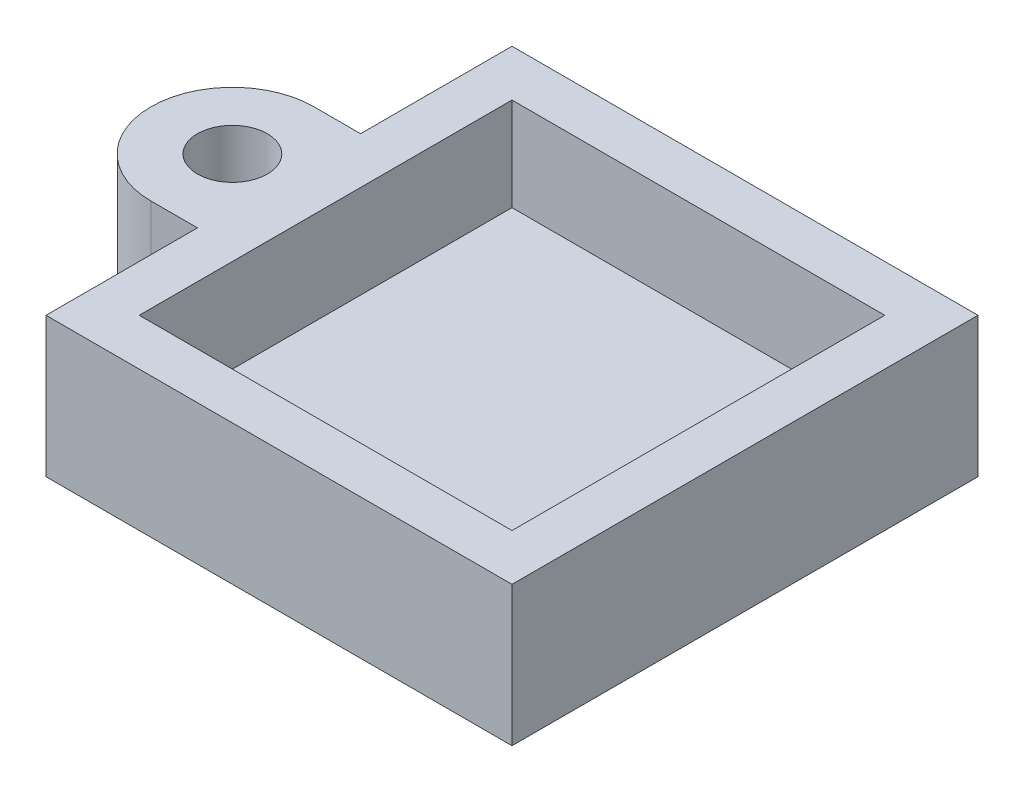
ISO-10303-21;
HEADER;
FILE_DESCRIPTION(('STEP AP214'),'2;1');
FILE_NAME('part.step','',(''),(''),'','','');
FILE_SCHEMA(('AUTOMOTIVE_DESIGN { 1 0 10303 214 1 1 1 1 }'));
ENDSEC;
DATA;
#1=APPLICATION_CONTEXT('core data for automotive mechanical design processes');
#2=APPLICATION_PROTOCOL_DEFINITION('international standard','automotive_design',2000,#1);
#3=PRODUCT_CONTEXT('',#1,'mechanical');
#4=PRODUCT('Part','Part','',(#3));
#5=PRODUCT_RELATED_PRODUCT_CATEGORY('part','',(#4));
#6=PRODUCT_DEFINITION_FORMATION('','',#4);
#7=PRODUCT_DEFINITION_CONTEXT('part definition',#1,'design');
#8=PRODUCT_DEFINITION('design','',#6,#7);
#9=PRODUCT_DEFINITION_SHAPE('','',#8);
#10=(LENGTH_UNIT() NAMED_UNIT(*) SI_UNIT(.MILLI.,.METRE.));
#11=(NAMED_UNIT(*) PLANE_ANGLE_UNIT() SI_UNIT($,.RADIAN.));
#12=(NAMED_UNIT(*) SI_UNIT($,.STERADIAN.) SOLID_ANGLE_UNIT());
#13=UNCERTAINTY_MEASURE_WITH_UNIT(LENGTH_MEASURE(1.E-05),#10,'distance_accuracy_value','');
#14=(GEOMETRIC_REPRESENTATION_CONTEXT(3) GLOBAL_UNCERTAINTY_ASSIGNED_CONTEXT((#13)) GLOBAL_UNIT_ASSIGNED_CONTEXT((#10,
#11,#12)) REPRESENTATION_CONTEXT('',''));
#15=CARTESIAN_POINT('',(0.,0.,0.));
#16=DIRECTION('',(0.,0.,1.));
#17=DIRECTION('',(1.,0.,0.));
#18=AXIS2_PLACEMENT_3D('',#15,#16,#17);
#19=CARTESIAN_POINT('',(-4.,4.,-8.));
#20=DIRECTION('',(0.,1.,0.));
#21=DIRECTION('',(0.,0.,1.));
#22=AXIS2_PLACEMENT_3D('',#19,#20,#21);
#23=PLANE('',#22);
#24=DIRECTION('',(1.,0.,0.));
#25=VECTOR('',#24,1.);
#26=CARTESIAN_POINT('',(0.,4.,0.));
#27=LINE('',#26,#25);
#28=CARTESIAN_POINT('',(0.,4.,0.));
#29=VERTEX_POINT('',#28);
#30=CARTESIAN_POINT('',(16.,4.,0.));
#31=VERTEX_POINT('',#30);
#32=EDGE_CURVE('E192',#29,#31,#27,.T.);
#33=ORIENTED_EDGE('',*,*,#32,.F.);
#34=DIRECTION('',(0.,0.,1.));
#35=VECTOR('',#34,1.);
#36=CARTESIAN_POINT('',(0.,4.,0.));
#37=LINE('',#36,#35);
#38=CARTESIAN_POINT('',(0.,4.,-16.));
#39=VERTEX_POINT('',#38);
#40=EDGE_CURVE('E189',#39,#29,#37,.T.);
#41=ORIENTED_EDGE('',*,*,#40,.F.);
#42=DIRECTION('',(-1.,0.,0.));
#43=VECTOR('',#42,1.);
#44=CARTESIAN_POINT('',(0.,4.,-16.));
#45=LINE('',#44,#43);
#46=CARTESIAN_POINT('',(16.,4.,-16.));
#47=VERTEX_POINT('',#46);
#48=EDGE_CURVE('E199',#47,#39,#45,.T.);
#49=ORIENTED_EDGE('',*,*,#48,.F.);
#50=DIRECTION('',(0.,0.,-1.));
#51=VECTOR('',#50,1.);
#52=CARTESIAN_POINT('',(16.,4.,0.));
#53=LINE('',#52,#51);
#54=EDGE_CURVE('E196',#31,#47,#53,.T.);
#55=ORIENTED_EDGE('',*,*,#54,.F.);
#56=EDGE_LOOP('',(#33,#41,#49,#55));
#57=FACE_BOUND('',#56,.T.);
#58=DIRECTION('',(0.,0.,1.));
#59=VECTOR('',#58,1.);
#60=CARTESIAN_POINT('',(-2.,4.,-18.));
#61=LINE('',#60,#59);
#62=CARTESIAN_POINT('',(-2.,4.,-18.));
#63=VERTEX_POINT('',#62);
#64=CARTESIAN_POINT('',(-2.,4.,-11.5));
#65=VERTEX_POINT('',#64);
#66=EDGE_CURVE('E228',#63,#65,#61,.T.);
#67=ORIENTED_EDGE('',*,*,#66,.T.);
#68=DIRECTION('',(-1.,0.,0.));
#69=VECTOR('',#68,1.);
#70=CARTESIAN_POINT('',(-4.,4.,-11.5));
#71=LINE('',#70,#69);
#72=CARTESIAN_POINT('',(-4.,4.,-11.5));
#73=VERTEX_POINT('',#72);
#74=EDGE_CURVE('E231',#65,#73,#71,.T.);
#75=ORIENTED_EDGE('',*,*,#74,.T.);
#76=CARTESIAN_POINT('',(-4.,4.,-8.));
#77=DIRECTION('',(0.,1.,0.));
#78=DIRECTION('',(0.,0.,1.));
#79=AXIS2_PLACEMENT_3D('',#76,#77,#78);
#80=CIRCLE('',#79,3.5);
#81=CARTESIAN_POINT('',(-4.,4.,-4.5));
#82=VERTEX_POINT('',#81);
#83=EDGE_CURVE('E234',#73,#82,#80,.T.);
#84=ORIENTED_EDGE('',*,*,#83,.T.);
#85=DIRECTION('',(1.,0.,0.));
#86=VECTOR('',#85,1.);
#87=CARTESIAN_POINT('',(-4.,4.,-4.5));
#88=LINE('',#87,#86);
#89=CARTESIAN_POINT('',(-2.,4.,-4.5));
#90=VERTEX_POINT('',#89);
#91=EDGE_CURVE('E237',#82,#90,#88,.T.);
#92=ORIENTED_EDGE('',*,*,#91,.T.);
#93=DIRECTION('',(0.,0.,1.));
#94=VECTOR('',#93,1.);
#95=CARTESIAN_POINT('',(-2.,4.,-4.5));
#96=LINE('',#95,#94);
#97=CARTESIAN_POINT('',(-2.,4.,2.));
#98=VERTEX_POINT('',#97);
#99=EDGE_CURVE('E240',#90,#98,#96,.T.);
#100=ORIENTED_EDGE('',*,*,#99,.T.);
#101=DIRECTION('',(1.,0.,0.));
#102=VECTOR('',#101,1.);
#103=CARTESIAN_POINT('',(-2.,4.,2.));
#104=LINE('',#103,#102);
#105=CARTESIAN_POINT('',(18.,4.,2.));
#106=VERTEX_POINT('',#105);
#107=EDGE_CURVE('E136',#98,#106,#104,.T.);
#108=ORIENTED_EDGE('',*,*,#107,.T.);
#109=DIRECTION('',(0.,0.,-1.));
#110=VECTOR('',#109,1.);
#111=CARTESIAN_POINT('',(18.,4.,-18.));
#112=LINE('',#111,#110);
#113=CARTESIAN_POINT('',(18.,4.,-18.));
#114=VERTEX_POINT('',#113);
#115=EDGE_CURVE('E245',#106,#114,#112,.T.);
#116=ORIENTED_EDGE('',*,*,#115,.T.);
#117=DIRECTION('',(-1.,0.,0.));
#118=VECTOR('',#117,1.);
#119=CARTESIAN_POINT('',(-2.,4.,-18.));
#120=LINE('',#119,#118);
#121=EDGE_CURVE('E63',#114,#63,#120,.T.);
#122=ORIENTED_EDGE('',*,*,#121,.T.);
#123=EDGE_LOOP('',(#67,#75,#84,#92,#100,#108,#116,#122));
#124=FACE_BOUND('',#123,.T.);
#125=CARTESIAN_POINT('',(-4.,4.,-8.));
#126=DIRECTION('',(0.,1.,0.));
#127=DIRECTION('',(0.,0.,1.));
#128=AXIS2_PLACEMENT_3D('',#125,#126,#127);
#129=CIRCLE('',#128,1.5);
#130=CARTESIAN_POINT('',(-4.,4.,-6.5));
#131=VERTEX_POINT('',#130);
#132=EDGE_CURVE('E181',#131,#131,#129,.T.);
#133=ORIENTED_EDGE('',*,*,#132,.F.);
#134=EDGE_LOOP('',(#133));
#135=FACE_BOUND('',#134,.T.);
#136=ADVANCED_FACE('F39',(#57,#124,#135),#23,.T.);
#137=CARTESIAN_POINT('',(-2.,4.,-18.));
#138=DIRECTION('',(1.,0.,0.));
#139=DIRECTION('',(0.,0.,-1.));
#140=AXIS2_PLACEMENT_3D('',#137,#138,#139);
#141=PLANE('',#140);
#142=DIRECTION('',(0.,-1.,0.));
#143=VECTOR('',#142,1.);
#144=CARTESIAN_POINT('',(-2.,4.,-18.));
#145=LINE('',#144,#143);
#146=CARTESIAN_POINT('',(-2.,-2.,-18.));
#147=VERTEX_POINT('',#146);
#148=EDGE_CURVE('E250',#63,#147,#145,.T.);
#149=ORIENTED_EDGE('',*,*,#148,.T.);
#150=DIRECTION('',(0.,0.,-1.));
#151=VECTOR('',#150,1.);
#152=CARTESIAN_POINT('',(-2.,-2.,-18.));
#153=LINE('',#152,#151);
#154=CARTESIAN_POINT('',(-2.,-2.,-11.5));
#155=VERTEX_POINT('',#154);
#156=EDGE_CURVE('E171',#155,#147,#153,.T.);
#157=ORIENTED_EDGE('',*,*,#156,.F.);
#158=DIRECTION('',(0.,-1.,0.));
#159=VECTOR('',#158,1.);
#160=CARTESIAN_POINT('',(-2.,4.,-11.5));
#161=LINE('',#160,#159);
#162=EDGE_CURVE('E11',#65,#155,#161,.T.);
#163=ORIENTED_EDGE('',*,*,#162,.F.);
#164=ORIENTED_EDGE('',*,*,#66,.F.);
#165=EDGE_LOOP('',(#149,#157,#163,#164));
#166=FACE_BOUND('',#165,.T.);
#167=ADVANCED_FACE('F41',(#166),#141,.F.);
#168=CARTESIAN_POINT('',(-4.,4.,-11.5));
#169=DIRECTION('',(0.,0.,1.));
#170=DIRECTION('',(1.,0.,0.));
#171=AXIS2_PLACEMENT_3D('',#168,#169,#170);
#172=PLANE('',#171);
#173=ORIENTED_EDGE('',*,*,#162,.T.);
#174=DIRECTION('',(1.,0.,0.));
#175=VECTOR('',#174,1.);
#176=CARTESIAN_POINT('',(-2.,-2.,-11.5));
#177=LINE('',#176,#175);
#178=CARTESIAN_POINT('',(-4.,-2.,-11.5));
#179=VERTEX_POINT('',#178);
#180=EDGE_CURVE('E167',#179,#155,#177,.T.);
#181=ORIENTED_EDGE('',*,*,#180,.F.);
#182=DIRECTION('',(0.,-1.,0.));
#183=VECTOR('',#182,1.);
#184=CARTESIAN_POINT('',(-4.,4.,-11.5));
#185=LINE('',#184,#183);
#186=EDGE_CURVE('E48',#73,#179,#185,.T.);
#187=ORIENTED_EDGE('',*,*,#186,.F.);
#188=ORIENTED_EDGE('',*,*,#74,.F.);
#189=EDGE_LOOP('',(#173,#181,#187,#188));
#190=FACE_BOUND('',#189,.T.);
#191=ADVANCED_FACE('F272',(#190),#172,.F.);
#192=CARTESIAN_POINT('',(-4.,4.,-8.));
#193=DIRECTION('',(0.,-1.,0.));
#194=DIRECTION('',(0.,0.,-1.));
#195=AXIS2_PLACEMENT_3D('',#192,#193,#194);
#196=CYLINDRICAL_SURFACE('',#195,3.5);
#197=ORIENTED_EDGE('',*,*,#186,.T.);
#198=CARTESIAN_POINT('',(-4.,-2.,-8.));
#199=DIRECTION('',(0.,-1.,0.));
#200=DIRECTION('',(0.,0.,-1.));
#201=AXIS2_PLACEMENT_3D('',#198,#199,#200);
#202=CIRCLE('',#201,3.5);
#203=CARTESIAN_POINT('',(-4.,-2.,-4.5));
#204=VERTEX_POINT('',#203);
#205=EDGE_CURVE('E163',#204,#179,#202,.T.);
#206=ORIENTED_EDGE('',*,*,#205,.F.);
#207=DIRECTION('',(0.,-1.,0.));
#208=VECTOR('',#207,1.);
#209=CARTESIAN_POINT('',(-4.,4.,-4.5));
#210=LINE('',#209,#208);
#211=EDGE_CURVE('E260',#82,#204,#210,.T.);
#212=ORIENTED_EDGE('',*,*,#211,.F.);
#213=ORIENTED_EDGE('',*,*,#83,.F.);
#214=EDGE_LOOP('',(#197,#206,#212,#213));
#215=FACE_BOUND('',#214,.T.);
#216=ADVANCED_FACE('F267',(#215),#196,.T.);
#217=CARTESIAN_POINT('',(-4.,4.,-4.5));
#218=DIRECTION('',(0.,0.,-1.));
#219=DIRECTION('',(-1.,0.,0.));
#220=AXIS2_PLACEMENT_3D('',#217,#218,#219);
#221=PLANE('',#220);
#222=ORIENTED_EDGE('',*,*,#211,.T.);
#223=DIRECTION('',(-1.,0.,0.));
#224=VECTOR('',#223,1.);
#225=CARTESIAN_POINT('',(-4.,-2.,-4.5));
#226=LINE('',#225,#224);
#227=CARTESIAN_POINT('',(-2.,-2.,-4.5));
#228=VERTEX_POINT('',#227);
#229=EDGE_CURVE('E151',#228,#204,#226,.T.);
#230=ORIENTED_EDGE('',*,*,#229,.F.);
#231=DIRECTION('',(0.,-1.,0.));
#232=VECTOR('',#231,1.);
#233=CARTESIAN_POINT('',(-2.,4.,-4.5));
#234=LINE('',#233,#232);
#235=EDGE_CURVE('E140',#90,#228,#234,.T.);
#236=ORIENTED_EDGE('',*,*,#235,.F.);
#237=ORIENTED_EDGE('',*,*,#91,.F.);
#238=EDGE_LOOP('',(#222,#230,#236,#237));
#239=FACE_BOUND('',#238,.T.);
#240=ADVANCED_FACE('F286',(#239),#221,.F.);
#241=CARTESIAN_POINT('',(-2.,4.,-4.5));
#242=DIRECTION('',(1.,0.,0.));
#243=DIRECTION('',(0.,0.,-1.));
#244=AXIS2_PLACEMENT_3D('',#241,#242,#243);
#245=PLANE('',#244);
#246=ORIENTED_EDGE('',*,*,#235,.T.);
#247=DIRECTION('',(0.,0.,-1.));
#248=VECTOR('',#247,1.);
#249=CARTESIAN_POINT('',(-2.,-2.,-4.5));
#250=LINE('',#249,#248);
#251=CARTESIAN_POINT('',(-2.,-2.,2.));
#252=VERTEX_POINT('',#251);
#253=EDGE_CURVE('E144',#252,#228,#250,.T.);
#254=ORIENTED_EDGE('',*,*,#253,.F.);
#255=DIRECTION('',(0.,-1.,0.));
#256=VECTOR('',#255,1.);
#257=CARTESIAN_POINT('',(-2.,4.,2.));
#258=LINE('',#257,#256);
#259=EDGE_CURVE('E130',#98,#252,#258,.T.);
#260=ORIENTED_EDGE('',*,*,#259,.F.);
#261=ORIENTED_EDGE('',*,*,#99,.F.);
#262=EDGE_LOOP('',(#246,#254,#260,#261));
#263=FACE_BOUND('',#262,.T.);
#264=ADVANCED_FACE('F145',(#263),#245,.F.);
#265=CARTESIAN_POINT('',(-2.,4.,2.));
#266=DIRECTION('',(0.,0.,-1.));
#267=DIRECTION('',(-1.,0.,0.));
#268=AXIS2_PLACEMENT_3D('',#265,#266,#267);
#269=PLANE('',#268);
#270=ORIENTED_EDGE('',*,*,#259,.T.);
#271=DIRECTION('',(-1.,0.,0.));
#272=VECTOR('',#271,1.);
#273=CARTESIAN_POINT('',(-2.,-2.,2.));
#274=LINE('',#273,#272);
#275=CARTESIAN_POINT('',(18.,-2.,2.));
#276=VERTEX_POINT('',#275);
#277=EDGE_CURVE('E135',#276,#252,#274,.T.);
#278=ORIENTED_EDGE('',*,*,#277,.F.);
#279=DIRECTION('',(0.,-1.,0.));
#280=VECTOR('',#279,1.);
#281=CARTESIAN_POINT('',(18.,4.,2.));
#282=LINE('',#281,#280);
#283=EDGE_CURVE('E141',#106,#276,#282,.T.);
#284=ORIENTED_EDGE('',*,*,#283,.F.);
#285=ORIENTED_EDGE('',*,*,#107,.F.);
#286=EDGE_LOOP('',(#270,#278,#284,#285));
#287=FACE_BOUND('',#286,.T.);
#288=ADVANCED_FACE('F132',(#287),#269,.F.);
#289=CARTESIAN_POINT('',(18.,4.,-18.));
#290=DIRECTION('',(-1.,0.,0.));
#291=DIRECTION('',(0.,0.,1.));
#292=AXIS2_PLACEMENT_3D('',#289,#290,#291);
#293=PLANE('',#292);
#294=ORIENTED_EDGE('',*,*,#283,.T.);
#295=DIRECTION('',(0.,0.,1.));
#296=VECTOR('',#295,1.);
#297=CARTESIAN_POINT('',(18.,-2.,2.));
#298=LINE('',#297,#296);
#299=CARTESIAN_POINT('',(18.,-2.,-18.));
#300=VERTEX_POINT('',#299);
#301=EDGE_CURVE('E157',#300,#276,#298,.T.);
#302=ORIENTED_EDGE('',*,*,#301,.F.);
#303=DIRECTION('',(0.,-1.,0.));
#304=VECTOR('',#303,1.);
#305=CARTESIAN_POINT('',(18.,4.,-18.));
#306=LINE('',#305,#304);
#307=EDGE_CURVE('E253',#114,#300,#306,.T.);
#308=ORIENTED_EDGE('',*,*,#307,.F.);
#309=ORIENTED_EDGE('',*,*,#115,.F.);
#310=EDGE_LOOP('',(#294,#302,#308,#309));
#311=FACE_BOUND('',#310,.T.);
#312=ADVANCED_FACE('F282',(#311),#293,.F.);
#313=CARTESIAN_POINT('',(-2.,4.,-18.));
#314=DIRECTION('',(0.,0.,1.));
#315=DIRECTION('',(1.,0.,0.));
#316=AXIS2_PLACEMENT_3D('',#313,#314,#315);
#317=PLANE('',#316);
#318=ORIENTED_EDGE('',*,*,#307,.T.);
#319=DIRECTION('',(1.,0.,0.));
#320=VECTOR('',#319,1.);
#321=CARTESIAN_POINT('',(18.,-2.,-18.));
#322=LINE('',#321,#320);
#323=EDGE_CURVE('E175',#147,#300,#322,.T.);
#324=ORIENTED_EDGE('',*,*,#323,.F.);
#325=ORIENTED_EDGE('',*,*,#148,.F.);
#326=ORIENTED_EDGE('',*,*,#121,.F.);
#327=EDGE_LOOP('',(#318,#324,#325,#326));
#328=FACE_BOUND('',#327,.T.);
#329=ADVANCED_FACE('F278',(#328),#317,.F.);
#330=CARTESIAN_POINT('',(0.,4.,0.));
#331=DIRECTION('',(1.,0.,0.));
#332=DIRECTION('',(0.,0.,-1.));
#333=AXIS2_PLACEMENT_3D('',#330,#331,#332);
#334=PLANE('',#333);
#335=DIRECTION('',(0.,0.,1.));
#336=VECTOR('',#335,1.);
#337=CARTESIAN_POINT('',(0.,0.,0.));
#338=LINE('',#337,#336);
#339=CARTESIAN_POINT('',(0.,0.,-16.));
#340=VERTEX_POINT('',#339);
#341=CARTESIAN_POINT('',(0.,0.,0.));
#342=VERTEX_POINT('',#341);
#343=EDGE_CURVE('E185',#340,#342,#338,.T.);
#344=ORIENTED_EDGE('',*,*,#343,.F.);
#345=DIRECTION('',(0.,-1.,0.));
#346=VECTOR('',#345,1.);
#347=CARTESIAN_POINT('',(0.,4.,-16.));
#348=LINE('',#347,#346);
#349=EDGE_CURVE('E202',#39,#340,#348,.T.);
#350=ORIENTED_EDGE('',*,*,#349,.F.);
#351=ORIENTED_EDGE('',*,*,#40,.T.);
#352=DIRECTION('',(0.,-1.,0.));
#353=VECTOR('',#352,1.);
#354=CARTESIAN_POINT('',(0.,4.,0.));
#355=LINE('',#354,#353);
#356=EDGE_CURVE('E224',#29,#342,#355,.T.);
#357=ORIENTED_EDGE('',*,*,#356,.T.);
#358=EDGE_LOOP('',(#344,#350,#351,#357));
#359=FACE_BOUND('',#358,.T.);
#360=ADVANCED_FACE('F304',(#359),#334,.T.);
#361=CARTESIAN_POINT('',(0.,4.,0.));
#362=DIRECTION('',(0.,0.,-1.));
#363=DIRECTION('',(-1.,0.,0.));
#364=AXIS2_PLACEMENT_3D('',#361,#362,#363);
#365=PLANE('',#364);
#366=DIRECTION('',(1.,0.,0.));
#367=VECTOR('',#366,1.);
#368=CARTESIAN_POINT('',(0.,0.,0.));
#369=LINE('',#368,#367);
#370=CARTESIAN_POINT('',(16.,0.,0.));
#371=VERTEX_POINT('',#370);
#372=EDGE_CURVE('E206',#342,#371,#369,.T.);
#373=ORIENTED_EDGE('',*,*,#372,.F.);
#374=ORIENTED_EDGE('',*,*,#356,.F.);
#375=ORIENTED_EDGE('',*,*,#32,.T.);
#376=DIRECTION('',(0.,-1.,0.));
#377=VECTOR('',#376,1.);
#378=CARTESIAN_POINT('',(16.,4.,0.));
#379=LINE('',#378,#377);
#380=EDGE_CURVE('E221',#31,#371,#379,.T.);
#381=ORIENTED_EDGE('',*,*,#380,.T.);
#382=EDGE_LOOP('',(#373,#374,#375,#381));
#383=FACE_BOUND('',#382,.T.);
#384=ADVANCED_FACE('F329',(#383),#365,.T.);
#385=CARTESIAN_POINT('',(16.,4.,0.));
#386=DIRECTION('',(-1.,0.,0.));
#387=DIRECTION('',(0.,0.,1.));
#388=AXIS2_PLACEMENT_3D('',#385,#386,#387);
#389=PLANE('',#388);
#390=DIRECTION('',(0.,0.,-1.));
#391=VECTOR('',#390,1.);
#392=CARTESIAN_POINT('',(16.,0.,0.));
#393=LINE('',#392,#391);
#394=CARTESIAN_POINT('',(16.,0.,-16.));
#395=VERTEX_POINT('',#394);
#396=EDGE_CURVE('E210',#371,#395,#393,.T.);
#397=ORIENTED_EDGE('',*,*,#396,.F.);
#398=ORIENTED_EDGE('',*,*,#380,.F.);
#399=ORIENTED_EDGE('',*,*,#54,.T.);
#400=DIRECTION('',(0.,-1.,0.));
#401=VECTOR('',#400,1.);
#402=CARTESIAN_POINT('',(16.,4.,-16.));
#403=LINE('',#402,#401);
#404=EDGE_CURVE('E55',#47,#395,#403,.T.);
#405=ORIENTED_EDGE('',*,*,#404,.T.);
#406=EDGE_LOOP('',(#397,#398,#399,#405));
#407=FACE_BOUND('',#406,.T.);
#408=ADVANCED_FACE('F336',(#407),#389,.T.);
#409=CARTESIAN_POINT('',(0.,4.,-16.));
#410=DIRECTION('',(0.,0.,1.));
#411=DIRECTION('',(1.,0.,0.));
#412=AXIS2_PLACEMENT_3D('',#409,#410,#411);
#413=PLANE('',#412);
#414=DIRECTION('',(-1.,0.,0.));
#415=VECTOR('',#414,1.);
#416=CARTESIAN_POINT('',(0.,0.,-16.));
#417=LINE('',#416,#415);
#418=EDGE_CURVE('E193',#395,#340,#417,.T.);
#419=ORIENTED_EDGE('',*,*,#418,.F.);
#420=ORIENTED_EDGE('',*,*,#404,.F.);
#421=ORIENTED_EDGE('',*,*,#48,.T.);
#422=ORIENTED_EDGE('',*,*,#349,.T.);
#423=EDGE_LOOP('',(#419,#420,#421,#422));
#424=FACE_BOUND('',#423,.T.);
#425=ADVANCED_FACE('F343',(#424),#413,.T.);
#426=CARTESIAN_POINT('',(-4.,4.,-8.));
#427=DIRECTION('',(0.,-1.,0.));
#428=DIRECTION('',(0.,0.,-1.));
#429=AXIS2_PLACEMENT_3D('',#426,#427,#428);
#430=CYLINDRICAL_SURFACE('',#429,1.5);
#431=ORIENTED_EDGE('',*,*,#132,.T.);
#432=EDGE_LOOP('',(#431));
#433=FACE_BOUND('',#432,.T.);
#434=CARTESIAN_POINT('',(-4.,0.,-8.));
#435=DIRECTION('',(0.,1.,0.));
#436=DIRECTION('',(0.,0.,1.));
#437=AXIS2_PLACEMENT_3D('',#434,#435,#436);
#438=CIRCLE('',#437,1.5);
#439=CARTESIAN_POINT('',(-4.,0.,-6.5));
#440=VERTEX_POINT('',#439);
#441=EDGE_CURVE('E180',#440,#440,#438,.T.);
#442=ORIENTED_EDGE('',*,*,#441,.F.);
#443=EDGE_LOOP('',(#442));
#444=FACE_BOUND('',#443,.T.);
#445=ADVANCED_FACE('F351',(#433,#444),#430,.F.);
#446=CARTESIAN_POINT('',(-4.,0.,-8.));
#447=DIRECTION('',(0.,-1.,0.));
#448=DIRECTION('',(0.,0.,-1.));
#449=AXIS2_PLACEMENT_3D('',#446,#447,#448);
#450=PLANE('',#449);
#451=ORIENTED_EDGE('',*,*,#441,.T.);
#452=EDGE_LOOP('',(#451));
#453=FACE_BOUND('',#452,.T.);
#454=ADVANCED_FACE('F359',(#453),#450,.F.);
#455=ORIENTED_EDGE('',*,*,#418,.T.);
#456=ORIENTED_EDGE('',*,*,#343,.T.);
#457=ORIENTED_EDGE('',*,*,#372,.T.);
#458=ORIENTED_EDGE('',*,*,#396,.T.);
#459=EDGE_LOOP('',(#455,#456,#457,#458));
#460=FACE_BOUND('',#459,.T.);
#461=ADVANCED_FACE('F367',(#460),#450,.F.);
#462=CARTESIAN_POINT('',(-4.,-2.,-8.));
#463=DIRECTION('',(0.,-1.,0.));
#464=DIRECTION('',(0.,0.,-1.));
#465=AXIS2_PLACEMENT_3D('',#462,#463,#464);
#466=PLANE('',#465);
#467=ORIENTED_EDGE('',*,*,#277,.T.);
#468=ORIENTED_EDGE('',*,*,#253,.T.);
#469=ORIENTED_EDGE('',*,*,#229,.T.);
#470=ORIENTED_EDGE('',*,*,#205,.T.);
#471=ORIENTED_EDGE('',*,*,#180,.T.);
#472=ORIENTED_EDGE('',*,*,#156,.T.);
#473=ORIENTED_EDGE('',*,*,#323,.T.);
#474=ORIENTED_EDGE('',*,*,#301,.T.);
#475=EDGE_LOOP('',(#467,#468,#469,#470,#471,#472,#473,#474));
#476=FACE_BOUND('',#475,.T.);
#477=ADVANCED_FACE('F154',(#476),#466,.T.);
#478=CLOSED_SHELL('',(#136,#167,#191,#216,#240,#264,#288,#312,#329,#360,#384,#408,#425,#445,
#454,#461,#477));
#479=MANIFOLD_SOLID_BREP('B2',#478);
#480=ADVANCED_BREP_SHAPE_REPRESENTATION('',(#18,#479),#14);
#481=SHAPE_DEFINITION_REPRESENTATION(#9,#480);
ENDSEC;
END-ISO-10303-21;
